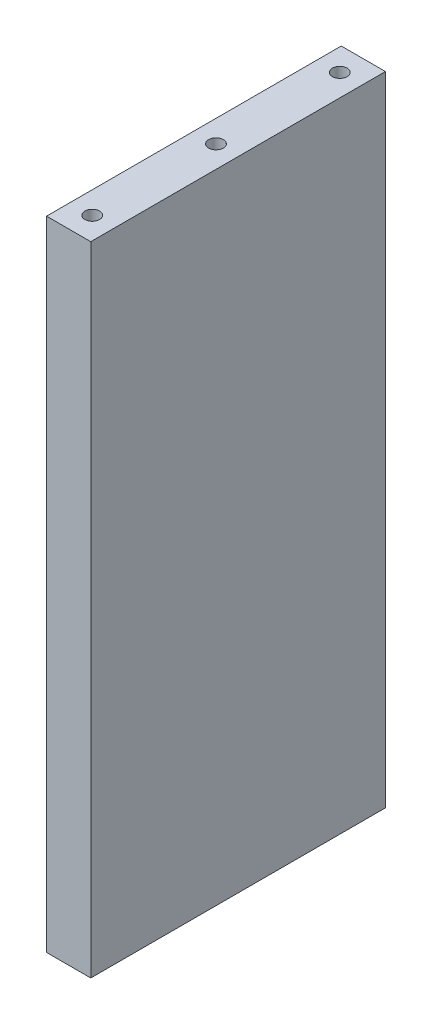
ISO-10303-21;
HEADER;
FILE_DESCRIPTION(('STEP AP214'),'2;1');
FILE_NAME('part.step','',(''),(''),'','','');
FILE_SCHEMA(('AUTOMOTIVE_DESIGN { 1 0 10303 214 1 1 1 1 }'));
ENDSEC;
DATA;
#1=APPLICATION_CONTEXT('core data for automotive mechanical design processes');
#2=APPLICATION_PROTOCOL_DEFINITION('international standard','automotive_design',2000,#1);
#3=PRODUCT_CONTEXT('',#1,'mechanical');
#4=PRODUCT('Part','Part','',(#3));
#5=PRODUCT_RELATED_PRODUCT_CATEGORY('part','',(#4));
#6=PRODUCT_DEFINITION_FORMATION('','',#4);
#7=PRODUCT_DEFINITION_CONTEXT('part definition',#1,'design');
#8=PRODUCT_DEFINITION('design','',#6,#7);
#9=PRODUCT_DEFINITION_SHAPE('','',#8);
#10=(LENGTH_UNIT() NAMED_UNIT(*) SI_UNIT(.MILLI.,.METRE.));
#11=(NAMED_UNIT(*) PLANE_ANGLE_UNIT() SI_UNIT($,.RADIAN.));
#12=(NAMED_UNIT(*) SI_UNIT($,.STERADIAN.) SOLID_ANGLE_UNIT());
#13=UNCERTAINTY_MEASURE_WITH_UNIT(LENGTH_MEASURE(1.E-05),#10,'distance_accuracy_value','');
#14=(GEOMETRIC_REPRESENTATION_CONTEXT(3) GLOBAL_UNCERTAINTY_ASSIGNED_CONTEXT((#13)) GLOBAL_UNIT_ASSIGNED_CONTEXT((#10,
#11,#12)) REPRESENTATION_CONTEXT('',''));
#15=CARTESIAN_POINT('',(0.,0.,0.));
#16=DIRECTION('',(0.,0.,1.));
#17=DIRECTION('',(1.,0.,0.));
#18=AXIS2_PLACEMENT_3D('',#15,#16,#17);
#19=CARTESIAN_POINT('',(-4.76250000000002,68.707,63.5));
#20=DIRECTION('',(1.,0.,0.));
#21=DIRECTION('',(0.,0.,-1.));
#22=AXIS2_PLACEMENT_3D('',#19,#20,#21);
#23=PLANE('',#22);
#24=DIRECTION('',(0.,-1.,0.));
#25=VECTOR('',#24,1.);
#26=CARTESIAN_POINT('',(-4.76250000000002,68.707,0.));
#27=LINE('',#26,#25);
#28=CARTESIAN_POINT('',(-4.76250000000002,68.707,0.));
#29=VERTEX_POINT('',#28);
#30=CARTESIAN_POINT('',(-4.76250000000002,-68.707,0.));
#31=VERTEX_POINT('',#30);
#32=EDGE_CURVE('E107',#29,#31,#27,.T.);
#33=ORIENTED_EDGE('',*,*,#32,.T.);
#34=DIRECTION('',(0.,0.,-1.));
#35=VECTOR('',#34,1.);
#36=CARTESIAN_POINT('',(-4.76250000000002,-68.707,63.5));
#37=LINE('',#36,#35);
#38=CARTESIAN_POINT('',(-4.76250000000002,-68.707,63.5));
#39=VERTEX_POINT('',#38);
#40=EDGE_CURVE('E11',#39,#31,#37,.T.);
#41=ORIENTED_EDGE('',*,*,#40,.F.);
#42=DIRECTION('',(0.,-1.,0.));
#43=VECTOR('',#42,1.);
#44=CARTESIAN_POINT('',(-4.76250000000002,68.707,63.5));
#45=LINE('',#44,#43);
#46=CARTESIAN_POINT('',(-4.76250000000002,68.707,63.5));
#47=VERTEX_POINT('',#46);
#48=EDGE_CURVE('E91',#47,#39,#45,.T.);
#49=ORIENTED_EDGE('',*,*,#48,.F.);
#50=DIRECTION('',(0.,0.,-1.));
#51=VECTOR('',#50,1.);
#52=CARTESIAN_POINT('',(-4.76250000000002,68.707,63.5));
#53=LINE('',#52,#51);
#54=EDGE_CURVE('E103',#47,#29,#53,.T.);
#55=ORIENTED_EDGE('',*,*,#54,.T.);
#56=EDGE_LOOP('',(#33,#41,#49,#55));
#57=FACE_BOUND('',#56,.T.);
#58=ADVANCED_FACE('F39',(#57),#23,.F.);
#59=CARTESIAN_POINT('',(-4.76250000000002,-68.707,63.5));
#60=DIRECTION('',(0.,1.,0.));
#61=DIRECTION('',(0.,0.,1.));
#62=AXIS2_PLACEMENT_3D('',#59,#60,#61);
#63=PLANE('',#62);
#64=CARTESIAN_POINT('',(0.,-68.707,5.08));
#65=DIRECTION('',(0.,1.,0.));
#66=DIRECTION('',(0.,0.,1.));
#67=AXIS2_PLACEMENT_3D('',#64,#65,#66);
#68=CIRCLE('',#67,1.5875);
#69=CARTESIAN_POINT('',(0.,-68.707,3.4925));
#70=VERTEX_POINT('',#69);
#71=EDGE_CURVE('E168',#70,#70,#68,.T.);
#72=ORIENTED_EDGE('',*,*,#71,.T.);
#73=EDGE_LOOP('',(#72));
#74=FACE_BOUND('',#73,.T.);
#75=CARTESIAN_POINT('',(0.,-68.707,31.75));
#76=DIRECTION('',(0.,1.,0.));
#77=DIRECTION('',(0.,0.,1.));
#78=AXIS2_PLACEMENT_3D('',#75,#76,#77);
#79=CIRCLE('',#78,1.5875);
#80=CARTESIAN_POINT('',(0.,-68.707,30.1625));
#81=VERTEX_POINT('',#80);
#82=EDGE_CURVE('E160',#81,#81,#79,.T.);
#83=ORIENTED_EDGE('',*,*,#82,.T.);
#84=EDGE_LOOP('',(#83));
#85=FACE_BOUND('',#84,.T.);
#86=CARTESIAN_POINT('',(0.,-68.707,58.42));
#87=DIRECTION('',(0.,1.,0.));
#88=DIRECTION('',(0.,0.,1.));
#89=AXIS2_PLACEMENT_3D('',#86,#87,#88);
#90=CIRCLE('',#89,1.5875);
#91=CARTESIAN_POINT('',(0.,-68.707,56.8325));
#92=VERTEX_POINT('',#91);
#93=EDGE_CURVE('E152',#92,#92,#90,.T.);
#94=ORIENTED_EDGE('',*,*,#93,.T.);
#95=EDGE_LOOP('',(#94));
#96=FACE_BOUND('',#95,.T.);
#97=DIRECTION('',(1.,0.,0.));
#98=VECTOR('',#97,1.);
#99=CARTESIAN_POINT('',(-4.76250000000002,-68.707,0.));
#100=LINE('',#99,#98);
#101=CARTESIAN_POINT('',(4.76250000000002,-68.707,0.));
#102=VERTEX_POINT('',#101);
#103=EDGE_CURVE('E96',#31,#102,#100,.T.);
#104=ORIENTED_EDGE('',*,*,#103,.T.);
#105=DIRECTION('',(0.,0.,-1.));
#106=VECTOR('',#105,1.);
#107=CARTESIAN_POINT('',(4.76250000000002,-68.707,63.5));
#108=LINE('',#107,#106);
#109=CARTESIAN_POINT('',(4.76250000000002,-68.707,63.5));
#110=VERTEX_POINT('',#109);
#111=EDGE_CURVE('E48',#110,#102,#108,.T.);
#112=ORIENTED_EDGE('',*,*,#111,.F.);
#113=DIRECTION('',(1.,0.,0.));
#114=VECTOR('',#113,1.);
#115=CARTESIAN_POINT('',(-4.76250000000002,-68.707,63.5));
#116=LINE('',#115,#114);
#117=EDGE_CURVE('E86',#39,#110,#116,.T.);
#118=ORIENTED_EDGE('',*,*,#117,.F.);
#119=ORIENTED_EDGE('',*,*,#40,.T.);
#120=EDGE_LOOP('',(#104,#112,#118,#119));
#121=FACE_BOUND('',#120,.T.);
#122=ADVANCED_FACE('F95',(#74,#85,#96,#121),#63,.F.);
#123=CARTESIAN_POINT('',(4.76250000000002,68.707,63.5));
#124=DIRECTION('',(-1.,0.,0.));
#125=DIRECTION('',(0.,0.,1.));
#126=AXIS2_PLACEMENT_3D('',#123,#124,#125);
#127=PLANE('',#126);
#128=DIRECTION('',(0.,1.,0.));
#129=VECTOR('',#128,1.);
#130=CARTESIAN_POINT('',(4.76250000000002,68.707,0.));
#131=LINE('',#130,#129);
#132=CARTESIAN_POINT('',(4.76250000000002,68.707,0.));
#133=VERTEX_POINT('',#132);
#134=EDGE_CURVE('E73',#102,#133,#131,.T.);
#135=ORIENTED_EDGE('',*,*,#134,.T.);
#136=DIRECTION('',(0.,0.,-1.));
#137=VECTOR('',#136,1.);
#138=CARTESIAN_POINT('',(4.76250000000002,68.707,63.5));
#139=LINE('',#138,#137);
#140=CARTESIAN_POINT('',(4.76250000000002,68.707,63.5));
#141=VERTEX_POINT('',#140);
#142=EDGE_CURVE('E98',#141,#133,#139,.T.);
#143=ORIENTED_EDGE('',*,*,#142,.F.);
#144=DIRECTION('',(0.,1.,0.));
#145=VECTOR('',#144,1.);
#146=CARTESIAN_POINT('',(4.76250000000002,68.707,63.5));
#147=LINE('',#146,#145);
#148=EDGE_CURVE('E89',#110,#141,#147,.T.);
#149=ORIENTED_EDGE('',*,*,#148,.F.);
#150=ORIENTED_EDGE('',*,*,#111,.T.);
#151=EDGE_LOOP('',(#135,#143,#149,#150));
#152=FACE_BOUND('',#151,.T.);
#153=ADVANCED_FACE('F99',(#152),#127,.F.);
#154=CARTESIAN_POINT('',(-4.76250000000002,68.707,63.5));
#155=DIRECTION('',(0.,-1.,0.));
#156=DIRECTION('',(0.,0.,-1.));
#157=AXIS2_PLACEMENT_3D('',#154,#155,#156);
#158=PLANE('',#157);
#159=CARTESIAN_POINT('',(0.,68.707,5.08));
#160=DIRECTION('',(0.,1.,0.));
#161=DIRECTION('',(0.,0.,1.));
#162=AXIS2_PLACEMENT_3D('',#159,#160,#161);
#163=CIRCLE('',#162,1.5875);
#164=CARTESIAN_POINT('',(0.,68.707,6.6675));
#165=VERTEX_POINT('',#164);
#166=EDGE_CURVE('E145',#165,#165,#163,.T.);
#167=ORIENTED_EDGE('',*,*,#166,.F.);
#168=EDGE_LOOP('',(#167));
#169=FACE_BOUND('',#168,.T.);
#170=CARTESIAN_POINT('',(0.,68.707,31.75));
#171=DIRECTION('',(0.,1.,0.));
#172=DIRECTION('',(0.,0.,1.));
#173=AXIS2_PLACEMENT_3D('',#170,#171,#172);
#174=CIRCLE('',#173,1.5875);
#175=CARTESIAN_POINT('',(0.,68.707,33.3375));
#176=VERTEX_POINT('',#175);
#177=EDGE_CURVE('E137',#176,#176,#174,.T.);
#178=ORIENTED_EDGE('',*,*,#177,.F.);
#179=EDGE_LOOP('',(#178));
#180=FACE_BOUND('',#179,.T.);
#181=CARTESIAN_POINT('',(0.,68.707,58.42));
#182=DIRECTION('',(0.,1.,0.));
#183=DIRECTION('',(0.,0.,1.));
#184=AXIS2_PLACEMENT_3D('',#181,#182,#183);
#185=CIRCLE('',#184,1.5875);
#186=CARTESIAN_POINT('',(0.,68.707,60.0075));
#187=VERTEX_POINT('',#186);
#188=EDGE_CURVE('E128',#187,#187,#185,.T.);
#189=ORIENTED_EDGE('',*,*,#188,.F.);
#190=EDGE_LOOP('',(#189));
#191=FACE_BOUND('',#190,.T.);
#192=DIRECTION('',(-1.,0.,0.));
#193=VECTOR('',#192,1.);
#194=CARTESIAN_POINT('',(-4.76250000000002,68.707,0.));
#195=LINE('',#194,#193);
#196=EDGE_CURVE('E79',#133,#29,#195,.T.);
#197=ORIENTED_EDGE('',*,*,#196,.T.);
#198=ORIENTED_EDGE('',*,*,#54,.F.);
#199=DIRECTION('',(-1.,0.,0.));
#200=VECTOR('',#199,1.);
#201=CARTESIAN_POINT('',(-4.76250000000002,68.707,63.5));
#202=LINE('',#201,#200);
#203=EDGE_CURVE('E56',#141,#47,#202,.T.);
#204=ORIENTED_EDGE('',*,*,#203,.F.);
#205=ORIENTED_EDGE('',*,*,#142,.T.);
#206=EDGE_LOOP('',(#197,#198,#204,#205));
#207=FACE_BOUND('',#206,.T.);
#208=ADVANCED_FACE('F121',(#169,#180,#191,#207),#158,.F.);
#209=CARTESIAN_POINT('',(0.,0.,63.5));
#210=DIRECTION('',(0.,0.,1.));
#211=DIRECTION('',(1.,0.,0.));
#212=AXIS2_PLACEMENT_3D('',#209,#210,#211);
#213=PLANE('',#212);
#214=ORIENTED_EDGE('',*,*,#48,.T.);
#215=ORIENTED_EDGE('',*,*,#117,.T.);
#216=ORIENTED_EDGE('',*,*,#148,.T.);
#217=ORIENTED_EDGE('',*,*,#203,.T.);
#218=EDGE_LOOP('',(#214,#215,#216,#217));
#219=FACE_BOUND('',#218,.T.);
#220=ADVANCED_FACE('F87',(#219),#213,.T.);
#221=CARTESIAN_POINT('',(0.,0.,0.));
#222=DIRECTION('',(0.,0.,1.));
#223=DIRECTION('',(1.,0.,0.));
#224=AXIS2_PLACEMENT_3D('',#221,#222,#223);
#225=PLANE('',#224);
#226=ORIENTED_EDGE('',*,*,#32,.F.);
#227=ORIENTED_EDGE('',*,*,#196,.F.);
#228=ORIENTED_EDGE('',*,*,#134,.F.);
#229=ORIENTED_EDGE('',*,*,#103,.F.);
#230=EDGE_LOOP('',(#226,#227,#228,#229));
#231=FACE_BOUND('',#230,.T.);
#232=ADVANCED_FACE('F124',(#231),#225,.F.);
#233=CARTESIAN_POINT('',(0.,59.182,58.42));
#234=DIRECTION('',(0.,1.,0.));
#235=DIRECTION('',(0.,0.,1.));
#236=AXIS2_PLACEMENT_3D('',#233,#234,#235);
#237=CYLINDRICAL_SURFACE('',#236,1.5875);
#238=CARTESIAN_POINT('',(0.,59.182,58.42));
#239=DIRECTION('',(0.,1.,0.));
#240=DIRECTION('',(0.,0.,1.));
#241=AXIS2_PLACEMENT_3D('',#238,#239,#240);
#242=CIRCLE('',#241,1.5875);
#243=CARTESIAN_POINT('',(0.,59.182,60.0075));
#244=VERTEX_POINT('',#243);
#245=EDGE_CURVE('E132',#244,#244,#242,.T.);
#246=CARTESIAN_POINT('',(0.,59.182,60.0075));
#247=CARTESIAN_POINT('',(0.,59.28121875,60.0075));
#248=CARTESIAN_POINT('',(0.,59.3804375,60.0075));
#249=CARTESIAN_POINT('',(0.,59.578875,60.0075));
#250=CARTESIAN_POINT('',(0.,59.67809375,60.0075));
#251=CARTESIAN_POINT('',(0.,59.87653125,60.0075));
#252=CARTESIAN_POINT('',(0.,59.97575,60.0075));
#253=CARTESIAN_POINT('',(0.,60.1741875,60.0075));
#254=CARTESIAN_POINT('',(0.,60.27340625,60.0075));
#255=CARTESIAN_POINT('',(0.,60.47184375,60.0075));
#256=CARTESIAN_POINT('',(0.,60.5710625,60.0075));
#257=CARTESIAN_POINT('',(0.,60.7695,60.0075));
#258=CARTESIAN_POINT('',(0.,60.86871875,60.0075));
#259=CARTESIAN_POINT('',(0.,61.06715625,60.0075));
#260=CARTESIAN_POINT('',(0.,61.166375,60.0075));
#261=CARTESIAN_POINT('',(0.,61.3648125,60.0075));
#262=CARTESIAN_POINT('',(0.,61.46403125,60.0075));
#263=CARTESIAN_POINT('',(0.,61.66246875,60.0075));
#264=CARTESIAN_POINT('',(0.,61.7616875,60.0075));
#265=CARTESIAN_POINT('',(0.,61.960125,60.0075));
#266=CARTESIAN_POINT('',(0.,62.05934375,60.0075));
#267=CARTESIAN_POINT('',(0.,62.25778125,60.0075));
#268=CARTESIAN_POINT('',(0.,62.357,60.0075));
#269=CARTESIAN_POINT('',(0.,62.5554375,60.0075));
#270=CARTESIAN_POINT('',(0.,62.65465625,60.0075));
#271=CARTESIAN_POINT('',(0.,62.85309375,60.0075));
#272=CARTESIAN_POINT('',(0.,62.9523125,60.0075));
#273=CARTESIAN_POINT('',(0.,63.15075,60.0075));
#274=CARTESIAN_POINT('',(0.,63.24996875,60.0075));
#275=CARTESIAN_POINT('',(0.,63.44840625,60.0075));
#276=CARTESIAN_POINT('',(0.,63.547625,60.0075));
#277=CARTESIAN_POINT('',(0.,63.7460625,60.0075));
#278=CARTESIAN_POINT('',(0.,63.84528125,60.0075));
#279=CARTESIAN_POINT('',(0.,64.04371875,60.0075));
#280=CARTESIAN_POINT('',(0.,64.1429375,60.0075));
#281=CARTESIAN_POINT('',(0.,64.341375,60.0075));
#282=CARTESIAN_POINT('',(0.,64.44059375,60.0075));
#283=CARTESIAN_POINT('',(0.,64.63903125,60.0075));
#284=CARTESIAN_POINT('',(0.,64.73825,60.0075));
#285=CARTESIAN_POINT('',(0.,64.9366875,60.0075));
#286=CARTESIAN_POINT('',(0.,65.03590625,60.0075));
#287=CARTESIAN_POINT('',(0.,65.23434375,60.0075));
#288=CARTESIAN_POINT('',(0.,65.3335625,60.0075));
#289=CARTESIAN_POINT('',(0.,65.532,60.0075));
#290=CARTESIAN_POINT('',(0.,65.63121875,60.0075));
#291=CARTESIAN_POINT('',(0.,65.82965625,60.0075));
#292=CARTESIAN_POINT('',(0.,65.928875,60.0075));
#293=CARTESIAN_POINT('',(0.,66.1273125,60.0075));
#294=CARTESIAN_POINT('',(0.,66.22653125,60.0075));
#295=CARTESIAN_POINT('',(0.,66.42496875,60.0075));
#296=CARTESIAN_POINT('',(0.,66.5241875,60.0075));
#297=CARTESIAN_POINT('',(0.,66.722625,60.0075));
#298=CARTESIAN_POINT('',(0.,66.82184375,60.0075));
#299=CARTESIAN_POINT('',(0.,67.02028125,60.0075));
#300=CARTESIAN_POINT('',(0.,67.1195,60.0075));
#301=CARTESIAN_POINT('',(0.,67.3179375,60.0075));
#302=CARTESIAN_POINT('',(0.,67.41715625,60.0075));
#303=CARTESIAN_POINT('',(0.,67.61559375,60.0075));
#304=CARTESIAN_POINT('',(0.,67.7148125,60.0075));
#305=CARTESIAN_POINT('',(0.,67.91325,60.0075));
#306=CARTESIAN_POINT('',(0.,68.01246875,60.0075));
#307=CARTESIAN_POINT('',(0.,68.21090625,60.0075));
#308=CARTESIAN_POINT('',(0.,68.310125,60.0075));
#309=CARTESIAN_POINT('',(0.,68.5085625,60.0075));
#310=CARTESIAN_POINT('',(0.,68.60778125,60.0075));
#311=CARTESIAN_POINT('',(0.,68.707,60.0075));
#312=B_SPLINE_CURVE_WITH_KNOTS('',3,(#246,#247,#248,#249,#250,#251,#252,#253,#254,#255,#256,
#257,#258,#259,#260,#261,#262,#263,#264,#265,#266,#267,#268,#269,#270,#271,#272,#273,#274,#275,
#276,#277,#278,#279,#280,#281,#282,#283,#284,#285,#286,#287,#288,#289,#290,#291,#292,#293,#294,
#295,#296,#297,#298,#299,#300,#301,#302,#303,#304,#305,#306,#307,#308,#309,#310,#311),
.UNSPECIFIED.,.F.,.F.,(4,2,2,2,2,2,2,2,2,2,2,2,2,2,2,2,2,2,2,2,2,2,2,2,2,2,2,2,2,2,2,2,4),(0.,
0.297656249999993,0.595312499999993,0.892968749999994,1.19062499999999,1.48828124999999,
1.78593749999999,2.08359374999999,2.38124999999999,2.67890624999999,2.97656249999999,
3.27421874999999,3.571875,3.86953125,4.1671875,4.46484375,4.7625,5.06015625,5.3578125,
5.65546875,5.953125,6.25078125,6.5484375,6.84609375,7.14375,7.44140625,7.7390625,8.03671875,
8.334375,8.63203125,8.9296875,9.22734375,9.525),.UNSPECIFIED.);
#313=EDGE_CURVE('BSEAM203',#244,#187,#312,.T.);
#314=ORIENTED_EDGE('',*,*,#245,.F.);
#315=ORIENTED_EDGE('',*,*,#188,.T.);
#316=ORIENTED_EDGE('',*,*,#313,.T.);
#317=ORIENTED_EDGE('',*,*,#313,.F.);
#318=EDGE_LOOP('',(#314,#316,#315,#317));
#319=FACE_BOUND('',#318,.T.);
#320=ADVANCED_FACE('F203',(#319),#237,.F.);
#321=CARTESIAN_POINT('',(0.,59.182,58.42));
#322=DIRECTION('',(0.,1.,0.));
#323=DIRECTION('',(0.,0.,1.));
#324=AXIS2_PLACEMENT_3D('',#321,#322,#323);
#325=PLANE('',#324);
#326=ORIENTED_EDGE('',*,*,#245,.T.);
#327=EDGE_LOOP('',(#326));
#328=FACE_BOUND('',#327,.T.);
#329=ADVANCED_FACE('F208',(#328),#325,.T.);
#330=CARTESIAN_POINT('',(0.,59.182,31.75));
#331=DIRECTION('',(0.,1.,0.));
#332=DIRECTION('',(0.,0.,1.));
#333=AXIS2_PLACEMENT_3D('',#330,#331,#332);
#334=CYLINDRICAL_SURFACE('',#333,1.5875);
#335=CARTESIAN_POINT('',(0.,59.182,31.75));
#336=DIRECTION('',(0.,1.,0.));
#337=DIRECTION('',(0.,0.,1.));
#338=AXIS2_PLACEMENT_3D('',#335,#336,#337);
#339=CIRCLE('',#338,1.5875);
#340=CARTESIAN_POINT('',(0.,59.182,33.3375));
#341=VERTEX_POINT('',#340);
#342=EDGE_CURVE('E141',#341,#341,#339,.T.);
#343=CARTESIAN_POINT('',(0.,59.182,33.3375));
#344=CARTESIAN_POINT('',(0.,59.28121875,33.3375));
#345=CARTESIAN_POINT('',(0.,59.3804375,33.3375));
#346=CARTESIAN_POINT('',(0.,59.578875,33.3375));
#347=CARTESIAN_POINT('',(0.,59.67809375,33.3375));
#348=CARTESIAN_POINT('',(0.,59.87653125,33.3375));
#349=CARTESIAN_POINT('',(0.,59.97575,33.3375));
#350=CARTESIAN_POINT('',(0.,60.1741875,33.3375));
#351=CARTESIAN_POINT('',(0.,60.27340625,33.3375));
#352=CARTESIAN_POINT('',(0.,60.47184375,33.3375));
#353=CARTESIAN_POINT('',(0.,60.5710625,33.3375));
#354=CARTESIAN_POINT('',(0.,60.7695,33.3375));
#355=CARTESIAN_POINT('',(0.,60.86871875,33.3375));
#356=CARTESIAN_POINT('',(0.,61.06715625,33.3375));
#357=CARTESIAN_POINT('',(0.,61.166375,33.3375));
#358=CARTESIAN_POINT('',(0.,61.3648125,33.3375));
#359=CARTESIAN_POINT('',(0.,61.46403125,33.3375));
#360=CARTESIAN_POINT('',(0.,61.66246875,33.3375));
#361=CARTESIAN_POINT('',(0.,61.7616875,33.3375));
#362=CARTESIAN_POINT('',(0.,61.960125,33.3375));
#363=CARTESIAN_POINT('',(0.,62.05934375,33.3375));
#364=CARTESIAN_POINT('',(0.,62.25778125,33.3375));
#365=CARTESIAN_POINT('',(0.,62.357,33.3375));
#366=CARTESIAN_POINT('',(0.,62.5554375,33.3375));
#367=CARTESIAN_POINT('',(0.,62.65465625,33.3375));
#368=CARTESIAN_POINT('',(0.,62.85309375,33.3375));
#369=CARTESIAN_POINT('',(0.,62.9523125,33.3375));
#370=CARTESIAN_POINT('',(0.,63.15075,33.3375));
#371=CARTESIAN_POINT('',(0.,63.24996875,33.3375));
#372=CARTESIAN_POINT('',(0.,63.44840625,33.3375));
#373=CARTESIAN_POINT('',(0.,63.547625,33.3375));
#374=CARTESIAN_POINT('',(0.,63.7460625,33.3375));
#375=CARTESIAN_POINT('',(0.,63.84528125,33.3375));
#376=CARTESIAN_POINT('',(0.,64.04371875,33.3375));
#377=CARTESIAN_POINT('',(0.,64.1429375,33.3375));
#378=CARTESIAN_POINT('',(0.,64.341375,33.3375));
#379=CARTESIAN_POINT('',(0.,64.44059375,33.3375));
#380=CARTESIAN_POINT('',(0.,64.63903125,33.3375));
#381=CARTESIAN_POINT('',(0.,64.73825,33.3375));
#382=CARTESIAN_POINT('',(0.,64.9366875,33.3375));
#383=CARTESIAN_POINT('',(0.,65.03590625,33.3375));
#384=CARTESIAN_POINT('',(0.,65.23434375,33.3375));
#385=CARTESIAN_POINT('',(0.,65.3335625,33.3375));
#386=CARTESIAN_POINT('',(0.,65.532,33.3375));
#387=CARTESIAN_POINT('',(0.,65.63121875,33.3375));
#388=CARTESIAN_POINT('',(0.,65.82965625,33.3375));
#389=CARTESIAN_POINT('',(0.,65.928875,33.3375));
#390=CARTESIAN_POINT('',(0.,66.1273125,33.3375));
#391=CARTESIAN_POINT('',(0.,66.22653125,33.3375));
#392=CARTESIAN_POINT('',(0.,66.42496875,33.3375));
#393=CARTESIAN_POINT('',(0.,66.5241875,33.3375));
#394=CARTESIAN_POINT('',(0.,66.722625,33.3375));
#395=CARTESIAN_POINT('',(0.,66.82184375,33.3375));
#396=CARTESIAN_POINT('',(0.,67.02028125,33.3375));
#397=CARTESIAN_POINT('',(0.,67.1195,33.3375));
#398=CARTESIAN_POINT('',(0.,67.3179375,33.3375));
#399=CARTESIAN_POINT('',(0.,67.41715625,33.3375));
#400=CARTESIAN_POINT('',(0.,67.61559375,33.3375));
#401=CARTESIAN_POINT('',(0.,67.7148125,33.3375));
#402=CARTESIAN_POINT('',(0.,67.91325,33.3375));
#403=CARTESIAN_POINT('',(0.,68.01246875,33.3375));
#404=CARTESIAN_POINT('',(0.,68.21090625,33.3375));
#405=CARTESIAN_POINT('',(0.,68.310125,33.3375));
#406=CARTESIAN_POINT('',(0.,68.5085625,33.3375));
#407=CARTESIAN_POINT('',(0.,68.60778125,33.3375));
#408=CARTESIAN_POINT('',(0.,68.707,33.3375));
#409=B_SPLINE_CURVE_WITH_KNOTS('',3,(#343,#344,#345,#346,#347,#348,#349,#350,#351,#352,#353,
#354,#355,#356,#357,#358,#359,#360,#361,#362,#363,#364,#365,#366,#367,#368,#369,#370,#371,#372,
#373,#374,#375,#376,#377,#378,#379,#380,#381,#382,#383,#384,#385,#386,#387,#388,#389,#390,#391,
#392,#393,#394,#395,#396,#397,#398,#399,#400,#401,#402,#403,#404,#405,#406,#407,#408),
.UNSPECIFIED.,.F.,.F.,(4,2,2,2,2,2,2,2,2,2,2,2,2,2,2,2,2,2,2,2,2,2,2,2,2,2,2,2,2,2,2,2,4),(0.,
0.297656249999993,0.595312499999993,0.892968749999994,1.19062499999999,1.48828124999999,
1.78593749999999,2.08359374999999,2.38124999999999,2.67890624999999,2.97656249999999,
3.27421874999999,3.571875,3.86953125,4.1671875,4.46484375,4.7625,5.06015625,5.3578125,
5.65546875,5.953125,6.25078125,6.5484375,6.84609375,7.14375,7.44140625,7.7390625,8.03671875,
8.334375,8.63203125,8.9296875,9.22734375,9.525),.UNSPECIFIED.);
#410=EDGE_CURVE('BSEAM212',#341,#176,#409,.T.);
#411=ORIENTED_EDGE('',*,*,#342,.F.);
#412=ORIENTED_EDGE('',*,*,#177,.T.);
#413=ORIENTED_EDGE('',*,*,#410,.T.);
#414=ORIENTED_EDGE('',*,*,#410,.F.);
#415=EDGE_LOOP('',(#411,#413,#412,#414));
#416=FACE_BOUND('',#415,.T.);
#417=ADVANCED_FACE('F212',(#416),#334,.F.);
#418=CARTESIAN_POINT('',(0.,59.182,31.75));
#419=DIRECTION('',(0.,1.,0.));
#420=DIRECTION('',(0.,0.,1.));
#421=AXIS2_PLACEMENT_3D('',#418,#419,#420);
#422=PLANE('',#421);
#423=ORIENTED_EDGE('',*,*,#342,.T.);
#424=EDGE_LOOP('',(#423));
#425=FACE_BOUND('',#424,.T.);
#426=ADVANCED_FACE('F216',(#425),#422,.T.);
#427=CARTESIAN_POINT('',(0.,59.182,5.08));
#428=DIRECTION('',(0.,1.,0.));
#429=DIRECTION('',(0.,0.,1.));
#430=AXIS2_PLACEMENT_3D('',#427,#428,#429);
#431=CYLINDRICAL_SURFACE('',#430,1.5875);
#432=CARTESIAN_POINT('',(0.,59.182,5.08));
#433=DIRECTION('',(0.,1.,0.));
#434=DIRECTION('',(0.,0.,1.));
#435=AXIS2_PLACEMENT_3D('',#432,#433,#434);
#436=CIRCLE('',#435,1.5875);
#437=CARTESIAN_POINT('',(0.,59.182,6.6675));
#438=VERTEX_POINT('',#437);
#439=EDGE_CURVE('E111',#438,#438,#436,.T.);
#440=CARTESIAN_POINT('',(0.,59.182,6.6675));
#441=CARTESIAN_POINT('',(0.,59.28121875,6.6675));
#442=CARTESIAN_POINT('',(0.,59.3804375,6.6675));
#443=CARTESIAN_POINT('',(0.,59.578875,6.6675));
#444=CARTESIAN_POINT('',(0.,59.67809375,6.6675));
#445=CARTESIAN_POINT('',(0.,59.87653125,6.6675));
#446=CARTESIAN_POINT('',(0.,59.97575,6.6675));
#447=CARTESIAN_POINT('',(0.,60.1741875,6.6675));
#448=CARTESIAN_POINT('',(0.,60.27340625,6.6675));
#449=CARTESIAN_POINT('',(0.,60.47184375,6.6675));
#450=CARTESIAN_POINT('',(0.,60.5710625,6.6675));
#451=CARTESIAN_POINT('',(0.,60.7695,6.6675));
#452=CARTESIAN_POINT('',(0.,60.86871875,6.6675));
#453=CARTESIAN_POINT('',(0.,61.06715625,6.6675));
#454=CARTESIAN_POINT('',(0.,61.166375,6.6675));
#455=CARTESIAN_POINT('',(0.,61.3648125,6.6675));
#456=CARTESIAN_POINT('',(0.,61.46403125,6.6675));
#457=CARTESIAN_POINT('',(0.,61.66246875,6.6675));
#458=CARTESIAN_POINT('',(0.,61.7616875,6.6675));
#459=CARTESIAN_POINT('',(0.,61.960125,6.6675));
#460=CARTESIAN_POINT('',(0.,62.05934375,6.6675));
#461=CARTESIAN_POINT('',(0.,62.25778125,6.6675));
#462=CARTESIAN_POINT('',(0.,62.357,6.6675));
#463=CARTESIAN_POINT('',(0.,62.5554375,6.6675));
#464=CARTESIAN_POINT('',(0.,62.65465625,6.6675));
#465=CARTESIAN_POINT('',(0.,62.85309375,6.6675));
#466=CARTESIAN_POINT('',(0.,62.9523125,6.6675));
#467=CARTESIAN_POINT('',(0.,63.15075,6.6675));
#468=CARTESIAN_POINT('',(0.,63.24996875,6.6675));
#469=CARTESIAN_POINT('',(0.,63.44840625,6.6675));
#470=CARTESIAN_POINT('',(0.,63.547625,6.6675));
#471=CARTESIAN_POINT('',(0.,63.7460625,6.6675));
#472=CARTESIAN_POINT('',(0.,63.84528125,6.6675));
#473=CARTESIAN_POINT('',(0.,64.04371875,6.6675));
#474=CARTESIAN_POINT('',(0.,64.1429375,6.6675));
#475=CARTESIAN_POINT('',(0.,64.341375,6.6675));
#476=CARTESIAN_POINT('',(0.,64.44059375,6.6675));
#477=CARTESIAN_POINT('',(0.,64.63903125,6.6675));
#478=CARTESIAN_POINT('',(0.,64.73825,6.6675));
#479=CARTESIAN_POINT('',(0.,64.9366875,6.6675));
#480=CARTESIAN_POINT('',(0.,65.03590625,6.6675));
#481=CARTESIAN_POINT('',(0.,65.23434375,6.6675));
#482=CARTESIAN_POINT('',(0.,65.3335625,6.6675));
#483=CARTESIAN_POINT('',(0.,65.532,6.6675));
#484=CARTESIAN_POINT('',(0.,65.63121875,6.6675));
#485=CARTESIAN_POINT('',(0.,65.82965625,6.6675));
#486=CARTESIAN_POINT('',(0.,65.928875,6.6675));
#487=CARTESIAN_POINT('',(0.,66.1273125,6.6675));
#488=CARTESIAN_POINT('',(0.,66.22653125,6.6675));
#489=CARTESIAN_POINT('',(0.,66.42496875,6.6675));
#490=CARTESIAN_POINT('',(0.,66.5241875,6.6675));
#491=CARTESIAN_POINT('',(0.,66.722625,6.6675));
#492=CARTESIAN_POINT('',(0.,66.82184375,6.6675));
#493=CARTESIAN_POINT('',(0.,67.02028125,6.6675));
#494=CARTESIAN_POINT('',(0.,67.1195,6.6675));
#495=CARTESIAN_POINT('',(0.,67.3179375,6.6675));
#496=CARTESIAN_POINT('',(0.,67.41715625,6.6675));
#497=CARTESIAN_POINT('',(0.,67.61559375,6.6675));
#498=CARTESIAN_POINT('',(0.,67.7148125,6.6675));
#499=CARTESIAN_POINT('',(0.,67.91325,6.6675));
#500=CARTESIAN_POINT('',(0.,68.01246875,6.6675));
#501=CARTESIAN_POINT('',(0.,68.21090625,6.6675));
#502=CARTESIAN_POINT('',(0.,68.310125,6.6675));
#503=CARTESIAN_POINT('',(0.,68.5085625,6.6675));
#504=CARTESIAN_POINT('',(0.,68.60778125,6.6675));
#505=CARTESIAN_POINT('',(0.,68.707,6.6675));
#506=B_SPLINE_CURVE_WITH_KNOTS('',3,(#440,#441,#442,#443,#444,#445,#446,#447,#448,#449,#450,
#451,#452,#453,#454,#455,#456,#457,#458,#459,#460,#461,#462,#463,#464,#465,#466,#467,#468,#469,
#470,#471,#472,#473,#474,#475,#476,#477,#478,#479,#480,#481,#482,#483,#484,#485,#486,#487,#488,
#489,#490,#491,#492,#493,#494,#495,#496,#497,#498,#499,#500,#501,#502,#503,#504,#505),
.UNSPECIFIED.,.F.,.F.,(4,2,2,2,2,2,2,2,2,2,2,2,2,2,2,2,2,2,2,2,2,2,2,2,2,2,2,2,2,2,2,2,4),(0.,
0.297656249999993,0.595312499999993,0.892968749999994,1.19062499999999,1.48828124999999,
1.78593749999999,2.08359374999999,2.38124999999999,2.67890624999999,2.97656249999999,
3.27421874999999,3.571875,3.86953125,4.1671875,4.46484375,4.7625,5.06015625,5.3578125,
5.65546875,5.953125,6.25078125,6.5484375,6.84609375,7.14375,7.44140625,7.7390625,8.03671875,
8.334375,8.63203125,8.9296875,9.22734375,9.525),.UNSPECIFIED.);
#507=EDGE_CURVE('BSEAM220',#438,#165,#506,.T.);
#508=ORIENTED_EDGE('',*,*,#439,.F.);
#509=ORIENTED_EDGE('',*,*,#166,.T.);
#510=ORIENTED_EDGE('',*,*,#507,.T.);
#511=ORIENTED_EDGE('',*,*,#507,.F.);
#512=EDGE_LOOP('',(#508,#510,#509,#511));
#513=FACE_BOUND('',#512,.T.);
#514=ADVANCED_FACE('F220',(#513),#431,.F.);
#515=CARTESIAN_POINT('',(0.,59.182,5.08));
#516=DIRECTION('',(0.,1.,0.));
#517=DIRECTION('',(0.,0.,1.));
#518=AXIS2_PLACEMENT_3D('',#515,#516,#517);
#519=PLANE('',#518);
#520=ORIENTED_EDGE('',*,*,#439,.T.);
#521=EDGE_LOOP('',(#520));
#522=FACE_BOUND('',#521,.T.);
#523=ADVANCED_FACE('F224',(#522),#519,.T.);
#524=CARTESIAN_POINT('',(0.,-59.182,58.42));
#525=DIRECTION('',(0.,-1.,0.));
#526=DIRECTION('',(0.,0.,-1.));
#527=AXIS2_PLACEMENT_3D('',#524,#525,#526);
#528=CYLINDRICAL_SURFACE('',#527,1.5875);
#529=CARTESIAN_POINT('',(0.,-59.182,58.42));
#530=DIRECTION('',(0.,1.,0.));
#531=DIRECTION('',(0.,0.,1.));
#532=AXIS2_PLACEMENT_3D('',#529,#530,#531);
#533=CIRCLE('',#532,1.5875);
#534=CARTESIAN_POINT('',(0.,-59.182,56.8325));
#535=VERTEX_POINT('',#534);
#536=EDGE_CURVE('E156',#535,#535,#533,.T.);
#537=CARTESIAN_POINT('',(0.,-59.182,56.8325));
#538=CARTESIAN_POINT('',(0.,-59.28121875,56.8325));
#539=CARTESIAN_POINT('',(0.,-59.3804375,56.8325));
#540=CARTESIAN_POINT('',(0.,-59.578875,56.8325));
#541=CARTESIAN_POINT('',(0.,-59.67809375,56.8325));
#542=CARTESIAN_POINT('',(0.,-59.87653125,56.8325));
#543=CARTESIAN_POINT('',(0.,-59.97575,56.8325));
#544=CARTESIAN_POINT('',(0.,-60.1741875,56.8325));
#545=CARTESIAN_POINT('',(0.,-60.27340625,56.8325));
#546=CARTESIAN_POINT('',(0.,-60.47184375,56.8325));
#547=CARTESIAN_POINT('',(0.,-60.5710625,56.8325));
#548=CARTESIAN_POINT('',(0.,-60.7695,56.8325));
#549=CARTESIAN_POINT('',(0.,-60.86871875,56.8325));
#550=CARTESIAN_POINT('',(0.,-61.06715625,56.8325));
#551=CARTESIAN_POINT('',(0.,-61.166375,56.8325));
#552=CARTESIAN_POINT('',(0.,-61.3648125,56.8325));
#553=CARTESIAN_POINT('',(0.,-61.46403125,56.8325));
#554=CARTESIAN_POINT('',(0.,-61.66246875,56.8325));
#555=CARTESIAN_POINT('',(0.,-61.7616875,56.8325));
#556=CARTESIAN_POINT('',(0.,-61.960125,56.8325));
#557=CARTESIAN_POINT('',(0.,-62.05934375,56.8325));
#558=CARTESIAN_POINT('',(0.,-62.25778125,56.8325));
#559=CARTESIAN_POINT('',(0.,-62.357,56.8325));
#560=CARTESIAN_POINT('',(0.,-62.5554375,56.8325));
#561=CARTESIAN_POINT('',(0.,-62.65465625,56.8325));
#562=CARTESIAN_POINT('',(0.,-62.85309375,56.8325));
#563=CARTESIAN_POINT('',(0.,-62.9523125,56.8325));
#564=CARTESIAN_POINT('',(0.,-63.15075,56.8325));
#565=CARTESIAN_POINT('',(0.,-63.24996875,56.8325));
#566=CARTESIAN_POINT('',(0.,-63.44840625,56.8325));
#567=CARTESIAN_POINT('',(0.,-63.547625,56.8325));
#568=CARTESIAN_POINT('',(0.,-63.7460625,56.8325));
#569=CARTESIAN_POINT('',(0.,-63.84528125,56.8325));
#570=CARTESIAN_POINT('',(0.,-64.04371875,56.8325));
#571=CARTESIAN_POINT('',(0.,-64.1429375,56.8325));
#572=CARTESIAN_POINT('',(0.,-64.341375,56.8325));
#573=CARTESIAN_POINT('',(0.,-64.44059375,56.8325));
#574=CARTESIAN_POINT('',(0.,-64.63903125,56.8325));
#575=CARTESIAN_POINT('',(0.,-64.73825,56.8325));
#576=CARTESIAN_POINT('',(0.,-64.9366875,56.8325));
#577=CARTESIAN_POINT('',(0.,-65.03590625,56.8325));
#578=CARTESIAN_POINT('',(0.,-65.23434375,56.8325));
#579=CARTESIAN_POINT('',(0.,-65.3335625,56.8325));
#580=CARTESIAN_POINT('',(0.,-65.532,56.8325));
#581=CARTESIAN_POINT('',(0.,-65.63121875,56.8325));
#582=CARTESIAN_POINT('',(0.,-65.82965625,56.8325));
#583=CARTESIAN_POINT('',(0.,-65.928875,56.8325));
#584=CARTESIAN_POINT('',(0.,-66.1273125,56.8325));
#585=CARTESIAN_POINT('',(0.,-66.22653125,56.8325));
#586=CARTESIAN_POINT('',(0.,-66.42496875,56.8325));
#587=CARTESIAN_POINT('',(0.,-66.5241875,56.8325));
#588=CARTESIAN_POINT('',(0.,-66.722625,56.8325));
#589=CARTESIAN_POINT('',(0.,-66.82184375,56.8325));
#590=CARTESIAN_POINT('',(0.,-67.02028125,56.8325));
#591=CARTESIAN_POINT('',(0.,-67.1195,56.8325));
#592=CARTESIAN_POINT('',(0.,-67.3179375,56.8325));
#593=CARTESIAN_POINT('',(0.,-67.41715625,56.8325));
#594=CARTESIAN_POINT('',(0.,-67.61559375,56.8325));
#595=CARTESIAN_POINT('',(0.,-67.7148125,56.8325));
#596=CARTESIAN_POINT('',(0.,-67.91325,56.8325));
#597=CARTESIAN_POINT('',(0.,-68.01246875,56.8325));
#598=CARTESIAN_POINT('',(0.,-68.21090625,56.8325));
#599=CARTESIAN_POINT('',(0.,-68.310125,56.8325));
#600=CARTESIAN_POINT('',(0.,-68.5085625,56.8325));
#601=CARTESIAN_POINT('',(0.,-68.60778125,56.8325));
#602=CARTESIAN_POINT('',(0.,-68.707,56.8325));
#603=B_SPLINE_CURVE_WITH_KNOTS('',3,(#537,#538,#539,#540,#541,#542,#543,#544,#545,#546,#547,
#548,#549,#550,#551,#552,#553,#554,#555,#556,#557,#558,#559,#560,#561,#562,#563,#564,#565,#566,
#567,#568,#569,#570,#571,#572,#573,#574,#575,#576,#577,#578,#579,#580,#581,#582,#583,#584,#585,
#586,#587,#588,#589,#590,#591,#592,#593,#594,#595,#596,#597,#598,#599,#600,#601,#602),
.UNSPECIFIED.,.F.,.F.,(4,2,2,2,2,2,2,2,2,2,2,2,2,2,2,2,2,2,2,2,2,2,2,2,2,2,2,2,2,2,2,2,4),(0.,
0.29765625,0.5953125,0.892968750000001,1.190625,1.48828125,1.7859375,2.08359375,2.38125,
2.67890625,2.9765625,3.27421875,3.57187500000001,3.86953125000001,4.16718750000001,
4.46484375000001,4.76250000000001,5.06015625000001,5.35781250000001,5.65546875000001,
5.95312500000001,6.25078125000001,6.54843750000001,6.84609375000001,7.14375000000001,
7.44140625000001,7.73906250000001,8.03671875,8.334375,8.63203125,8.9296875,9.22734375,9.525),.UNSPECIFIED.);
#604=EDGE_CURVE('BSEAM228',#535,#92,#603,.T.);
#605=ORIENTED_EDGE('',*,*,#536,.T.);
#606=ORIENTED_EDGE('',*,*,#93,.F.);
#607=ORIENTED_EDGE('',*,*,#604,.T.);
#608=ORIENTED_EDGE('',*,*,#604,.F.);
#609=EDGE_LOOP('',(#605,#607,#606,#608));
#610=FACE_BOUND('',#609,.T.);
#611=ADVANCED_FACE('F228',(#610),#528,.F.);
#612=CARTESIAN_POINT('',(0.,-59.182,58.42));
#613=DIRECTION('',(0.,-1.,0.));
#614=DIRECTION('',(0.,0.,1.));
#615=AXIS2_PLACEMENT_3D('',#612,#613,#614);
#616=PLANE('',#615);
#617=ORIENTED_EDGE('',*,*,#536,.F.);
#618=EDGE_LOOP('',(#617));
#619=FACE_BOUND('',#618,.T.);
#620=ADVANCED_FACE('F232',(#619),#616,.T.);
#621=CARTESIAN_POINT('',(0.,-59.182,31.75));
#622=DIRECTION('',(0.,-1.,0.));
#623=DIRECTION('',(0.,0.,-1.));
#624=AXIS2_PLACEMENT_3D('',#621,#622,#623);
#625=CYLINDRICAL_SURFACE('',#624,1.5875);
#626=CARTESIAN_POINT('',(0.,-59.182,31.75));
#627=DIRECTION('',(0.,1.,0.));
#628=DIRECTION('',(0.,0.,1.));
#629=AXIS2_PLACEMENT_3D('',#626,#627,#628);
#630=CIRCLE('',#629,1.5875);
#631=CARTESIAN_POINT('',(0.,-59.182,30.1625));
#632=VERTEX_POINT('',#631);
#633=EDGE_CURVE('E164',#632,#632,#630,.T.);
#634=CARTESIAN_POINT('',(0.,-59.182,30.1625));
#635=CARTESIAN_POINT('',(0.,-59.28121875,30.1625));
#636=CARTESIAN_POINT('',(0.,-59.3804375,30.1625));
#637=CARTESIAN_POINT('',(0.,-59.578875,30.1625));
#638=CARTESIAN_POINT('',(0.,-59.67809375,30.1625));
#639=CARTESIAN_POINT('',(0.,-59.87653125,30.1625));
#640=CARTESIAN_POINT('',(0.,-59.97575,30.1625));
#641=CARTESIAN_POINT('',(0.,-60.1741875,30.1625));
#642=CARTESIAN_POINT('',(0.,-60.27340625,30.1625));
#643=CARTESIAN_POINT('',(0.,-60.47184375,30.1625));
#644=CARTESIAN_POINT('',(0.,-60.5710625,30.1625));
#645=CARTESIAN_POINT('',(0.,-60.7695,30.1625));
#646=CARTESIAN_POINT('',(0.,-60.86871875,30.1625));
#647=CARTESIAN_POINT('',(0.,-61.06715625,30.1625));
#648=CARTESIAN_POINT('',(0.,-61.166375,30.1625));
#649=CARTESIAN_POINT('',(0.,-61.3648125,30.1625));
#650=CARTESIAN_POINT('',(0.,-61.46403125,30.1625));
#651=CARTESIAN_POINT('',(0.,-61.66246875,30.1625));
#652=CARTESIAN_POINT('',(0.,-61.7616875,30.1625));
#653=CARTESIAN_POINT('',(0.,-61.960125,30.1625));
#654=CARTESIAN_POINT('',(0.,-62.05934375,30.1625));
#655=CARTESIAN_POINT('',(0.,-62.25778125,30.1625));
#656=CARTESIAN_POINT('',(0.,-62.357,30.1625));
#657=CARTESIAN_POINT('',(0.,-62.5554375,30.1625));
#658=CARTESIAN_POINT('',(0.,-62.65465625,30.1625));
#659=CARTESIAN_POINT('',(0.,-62.85309375,30.1625));
#660=CARTESIAN_POINT('',(0.,-62.9523125,30.1625));
#661=CARTESIAN_POINT('',(0.,-63.15075,30.1625));
#662=CARTESIAN_POINT('',(0.,-63.24996875,30.1625));
#663=CARTESIAN_POINT('',(0.,-63.44840625,30.1625));
#664=CARTESIAN_POINT('',(0.,-63.547625,30.1625));
#665=CARTESIAN_POINT('',(0.,-63.7460625,30.1625));
#666=CARTESIAN_POINT('',(0.,-63.84528125,30.1625));
#667=CARTESIAN_POINT('',(0.,-64.04371875,30.1625));
#668=CARTESIAN_POINT('',(0.,-64.1429375,30.1625));
#669=CARTESIAN_POINT('',(0.,-64.341375,30.1625));
#670=CARTESIAN_POINT('',(0.,-64.44059375,30.1625));
#671=CARTESIAN_POINT('',(0.,-64.63903125,30.1625));
#672=CARTESIAN_POINT('',(0.,-64.73825,30.1625));
#673=CARTESIAN_POINT('',(0.,-64.9366875,30.1625));
#674=CARTESIAN_POINT('',(0.,-65.03590625,30.1625));
#675=CARTESIAN_POINT('',(0.,-65.23434375,30.1625));
#676=CARTESIAN_POINT('',(0.,-65.3335625,30.1625));
#677=CARTESIAN_POINT('',(0.,-65.532,30.1625));
#678=CARTESIAN_POINT('',(0.,-65.63121875,30.1625));
#679=CARTESIAN_POINT('',(0.,-65.82965625,30.1625));
#680=CARTESIAN_POINT('',(0.,-65.928875,30.1625));
#681=CARTESIAN_POINT('',(0.,-66.1273125,30.1625));
#682=CARTESIAN_POINT('',(0.,-66.22653125,30.1625));
#683=CARTESIAN_POINT('',(0.,-66.42496875,30.1625));
#684=CARTESIAN_POINT('',(0.,-66.5241875,30.1625));
#685=CARTESIAN_POINT('',(0.,-66.722625,30.1625));
#686=CARTESIAN_POINT('',(0.,-66.82184375,30.1625));
#687=CARTESIAN_POINT('',(0.,-67.02028125,30.1625));
#688=CARTESIAN_POINT('',(0.,-67.1195,30.1625));
#689=CARTESIAN_POINT('',(0.,-67.3179375,30.1625));
#690=CARTESIAN_POINT('',(0.,-67.41715625,30.1625));
#691=CARTESIAN_POINT('',(0.,-67.61559375,30.1625));
#692=CARTESIAN_POINT('',(0.,-67.7148125,30.1625));
#693=CARTESIAN_POINT('',(0.,-67.91325,30.1625));
#694=CARTESIAN_POINT('',(0.,-68.01246875,30.1625));
#695=CARTESIAN_POINT('',(0.,-68.21090625,30.1625));
#696=CARTESIAN_POINT('',(0.,-68.310125,30.1625));
#697=CARTESIAN_POINT('',(0.,-68.5085625,30.1625));
#698=CARTESIAN_POINT('',(0.,-68.60778125,30.1625));
#699=CARTESIAN_POINT('',(0.,-68.707,30.1625));
#700=B_SPLINE_CURVE_WITH_KNOTS('',3,(#634,#635,#636,#637,#638,#639,#640,#641,#642,#643,#644,
#645,#646,#647,#648,#649,#650,#651,#652,#653,#654,#655,#656,#657,#658,#659,#660,#661,#662,#663,
#664,#665,#666,#667,#668,#669,#670,#671,#672,#673,#674,#675,#676,#677,#678,#679,#680,#681,#682,
#683,#684,#685,#686,#687,#688,#689,#690,#691,#692,#693,#694,#695,#696,#697,#698,#699),
.UNSPECIFIED.,.F.,.F.,(4,2,2,2,2,2,2,2,2,2,2,2,2,2,2,2,2,2,2,2,2,2,2,2,2,2,2,2,2,2,2,2,4),(0.,
0.29765625,0.5953125,0.892968750000001,1.190625,1.48828125,1.7859375,2.08359375,2.38125,
2.67890625,2.9765625,3.27421875,3.57187500000001,3.86953125000001,4.16718750000001,
4.46484375000001,4.76250000000001,5.06015625000001,5.35781250000001,5.65546875000001,
5.95312500000001,6.25078125000001,6.54843750000001,6.84609375000001,7.14375000000001,
7.44140625000001,7.73906250000001,8.03671875,8.334375,8.63203125,8.9296875,9.22734375,9.525),.UNSPECIFIED.);
#701=EDGE_CURVE('BSEAM236',#632,#81,#700,.T.);
#702=ORIENTED_EDGE('',*,*,#633,.T.);
#703=ORIENTED_EDGE('',*,*,#82,.F.);
#704=ORIENTED_EDGE('',*,*,#701,.T.);
#705=ORIENTED_EDGE('',*,*,#701,.F.);
#706=EDGE_LOOP('',(#702,#704,#703,#705));
#707=FACE_BOUND('',#706,.T.);
#708=ADVANCED_FACE('F236',(#707),#625,.F.);
#709=CARTESIAN_POINT('',(0.,-59.182,31.75));
#710=DIRECTION('',(0.,-1.,0.));
#711=DIRECTION('',(0.,0.,1.));
#712=AXIS2_PLACEMENT_3D('',#709,#710,#711);
#713=PLANE('',#712);
#714=ORIENTED_EDGE('',*,*,#633,.F.);
#715=EDGE_LOOP('',(#714));
#716=FACE_BOUND('',#715,.T.);
#717=ADVANCED_FACE('F185',(#716),#713,.T.);
#718=CARTESIAN_POINT('',(0.,-59.182,5.08));
#719=DIRECTION('',(0.,-1.,0.));
#720=DIRECTION('',(0.,0.,-1.));
#721=AXIS2_PLACEMENT_3D('',#718,#719,#720);
#722=CYLINDRICAL_SURFACE('',#721,1.5875);
#723=CARTESIAN_POINT('',(0.,-59.182,5.08));
#724=DIRECTION('',(0.,1.,0.));
#725=DIRECTION('',(0.,0.,1.));
#726=AXIS2_PLACEMENT_3D('',#723,#724,#725);
#727=CIRCLE('',#726,1.5875);
#728=CARTESIAN_POINT('',(0.,-59.182,3.4925));
#729=VERTEX_POINT('',#728);
#730=EDGE_CURVE('E133',#729,#729,#727,.T.);
#731=CARTESIAN_POINT('',(0.,-59.182,3.4925));
#732=CARTESIAN_POINT('',(0.,-59.28121875,3.4925));
#733=CARTESIAN_POINT('',(0.,-59.3804375,3.4925));
#734=CARTESIAN_POINT('',(0.,-59.578875,3.4925));
#735=CARTESIAN_POINT('',(0.,-59.67809375,3.4925));
#736=CARTESIAN_POINT('',(0.,-59.87653125,3.4925));
#737=CARTESIAN_POINT('',(0.,-59.97575,3.4925));
#738=CARTESIAN_POINT('',(0.,-60.1741875,3.4925));
#739=CARTESIAN_POINT('',(0.,-60.27340625,3.4925));
#740=CARTESIAN_POINT('',(0.,-60.47184375,3.4925));
#741=CARTESIAN_POINT('',(0.,-60.5710625,3.4925));
#742=CARTESIAN_POINT('',(0.,-60.7695,3.4925));
#743=CARTESIAN_POINT('',(0.,-60.86871875,3.4925));
#744=CARTESIAN_POINT('',(0.,-61.06715625,3.4925));
#745=CARTESIAN_POINT('',(0.,-61.166375,3.4925));
#746=CARTESIAN_POINT('',(0.,-61.3648125,3.4925));
#747=CARTESIAN_POINT('',(0.,-61.46403125,3.4925));
#748=CARTESIAN_POINT('',(0.,-61.66246875,3.4925));
#749=CARTESIAN_POINT('',(0.,-61.7616875,3.4925));
#750=CARTESIAN_POINT('',(0.,-61.960125,3.4925));
#751=CARTESIAN_POINT('',(0.,-62.05934375,3.4925));
#752=CARTESIAN_POINT('',(0.,-62.25778125,3.4925));
#753=CARTESIAN_POINT('',(0.,-62.357,3.4925));
#754=CARTESIAN_POINT('',(0.,-62.5554375,3.4925));
#755=CARTESIAN_POINT('',(0.,-62.65465625,3.4925));
#756=CARTESIAN_POINT('',(0.,-62.85309375,3.4925));
#757=CARTESIAN_POINT('',(0.,-62.9523125,3.4925));
#758=CARTESIAN_POINT('',(0.,-63.15075,3.4925));
#759=CARTESIAN_POINT('',(0.,-63.24996875,3.4925));
#760=CARTESIAN_POINT('',(0.,-63.44840625,3.4925));
#761=CARTESIAN_POINT('',(0.,-63.547625,3.4925));
#762=CARTESIAN_POINT('',(0.,-63.7460625,3.4925));
#763=CARTESIAN_POINT('',(0.,-63.84528125,3.4925));
#764=CARTESIAN_POINT('',(0.,-64.04371875,3.4925));
#765=CARTESIAN_POINT('',(0.,-64.1429375,3.4925));
#766=CARTESIAN_POINT('',(0.,-64.341375,3.4925));
#767=CARTESIAN_POINT('',(0.,-64.44059375,3.4925));
#768=CARTESIAN_POINT('',(0.,-64.63903125,3.4925));
#769=CARTESIAN_POINT('',(0.,-64.73825,3.4925));
#770=CARTESIAN_POINT('',(0.,-64.9366875,3.4925));
#771=CARTESIAN_POINT('',(0.,-65.03590625,3.4925));
#772=CARTESIAN_POINT('',(0.,-65.23434375,3.4925));
#773=CARTESIAN_POINT('',(0.,-65.3335625,3.4925));
#774=CARTESIAN_POINT('',(0.,-65.532,3.4925));
#775=CARTESIAN_POINT('',(0.,-65.63121875,3.4925));
#776=CARTESIAN_POINT('',(0.,-65.82965625,3.4925));
#777=CARTESIAN_POINT('',(0.,-65.928875,3.4925));
#778=CARTESIAN_POINT('',(0.,-66.1273125,3.4925));
#779=CARTESIAN_POINT('',(0.,-66.22653125,3.4925));
#780=CARTESIAN_POINT('',(0.,-66.42496875,3.4925));
#781=CARTESIAN_POINT('',(0.,-66.5241875,3.4925));
#782=CARTESIAN_POINT('',(0.,-66.722625,3.4925));
#783=CARTESIAN_POINT('',(0.,-66.82184375,3.4925));
#784=CARTESIAN_POINT('',(0.,-67.02028125,3.4925));
#785=CARTESIAN_POINT('',(0.,-67.1195,3.4925));
#786=CARTESIAN_POINT('',(0.,-67.3179375,3.4925));
#787=CARTESIAN_POINT('',(0.,-67.41715625,3.4925));
#788=CARTESIAN_POINT('',(0.,-67.61559375,3.4925));
#789=CARTESIAN_POINT('',(0.,-67.7148125,3.4925));
#790=CARTESIAN_POINT('',(0.,-67.91325,3.4925));
#791=CARTESIAN_POINT('',(0.,-68.01246875,3.4925));
#792=CARTESIAN_POINT('',(0.,-68.21090625,3.4925));
#793=CARTESIAN_POINT('',(0.,-68.310125,3.4925));
#794=CARTESIAN_POINT('',(0.,-68.5085625,3.4925));
#795=CARTESIAN_POINT('',(0.,-68.60778125,3.4925));
#796=CARTESIAN_POINT('',(0.,-68.707,3.4925));
#797=B_SPLINE_CURVE_WITH_KNOTS('',3,(#731,#732,#733,#734,#735,#736,#737,#738,#739,#740,#741,
#742,#743,#744,#745,#746,#747,#748,#749,#750,#751,#752,#753,#754,#755,#756,#757,#758,#759,#760,
#761,#762,#763,#764,#765,#766,#767,#768,#769,#770,#771,#772,#773,#774,#775,#776,#777,#778,#779,
#780,#781,#782,#783,#784,#785,#786,#787,#788,#789,#790,#791,#792,#793,#794,#795,#796),
.UNSPECIFIED.,.F.,.F.,(4,2,2,2,2,2,2,2,2,2,2,2,2,2,2,2,2,2,2,2,2,2,2,2,2,2,2,2,2,2,2,2,4),(0.,
0.29765625,0.5953125,0.892968750000001,1.190625,1.48828125,1.7859375,2.08359375,2.38125,
2.67890625,2.9765625,3.27421875,3.57187500000001,3.86953125000001,4.16718750000001,
4.46484375000001,4.76250000000001,5.06015625000001,5.35781250000001,5.65546875000001,
5.95312500000001,6.25078125000001,6.54843750000001,6.84609375000001,7.14375000000001,
7.44140625000001,7.73906250000001,8.03671875,8.334375,8.63203125,8.9296875,9.22734375,9.525),.UNSPECIFIED.);
#798=EDGE_CURVE('BSEAM176',#729,#70,#797,.T.);
#799=ORIENTED_EDGE('',*,*,#730,.T.);
#800=ORIENTED_EDGE('',*,*,#71,.F.);
#801=ORIENTED_EDGE('',*,*,#798,.T.);
#802=ORIENTED_EDGE('',*,*,#798,.F.);
#803=EDGE_LOOP('',(#799,#801,#800,#802));
#804=FACE_BOUND('',#803,.T.);
#805=ADVANCED_FACE('F176',(#804),#722,.F.);
#806=CARTESIAN_POINT('',(0.,-59.182,5.08));
#807=DIRECTION('',(0.,-1.,0.));
#808=DIRECTION('',(0.,0.,1.));
#809=AXIS2_PLACEMENT_3D('',#806,#807,#808);
#810=PLANE('',#809);
#811=ORIENTED_EDGE('',*,*,#730,.F.);
#812=EDGE_LOOP('',(#811));
#813=FACE_BOUND('',#812,.T.);
#814=ADVANCED_FACE('F179',(#813),#810,.T.);
#815=CLOSED_SHELL('',(#58,#122,#153,#208,#220,#232,#320,#329,#417,#426,#514,#523,#611,#620,#708,
#717,#805,#814));
#816=MANIFOLD_SOLID_BREP('B2',#815);
#817=ADVANCED_BREP_SHAPE_REPRESENTATION('',(#18,#816),#14);
#818=SHAPE_DEFINITION_REPRESENTATION(#9,#817);
ENDSEC;
END-ISO-10303-21;
